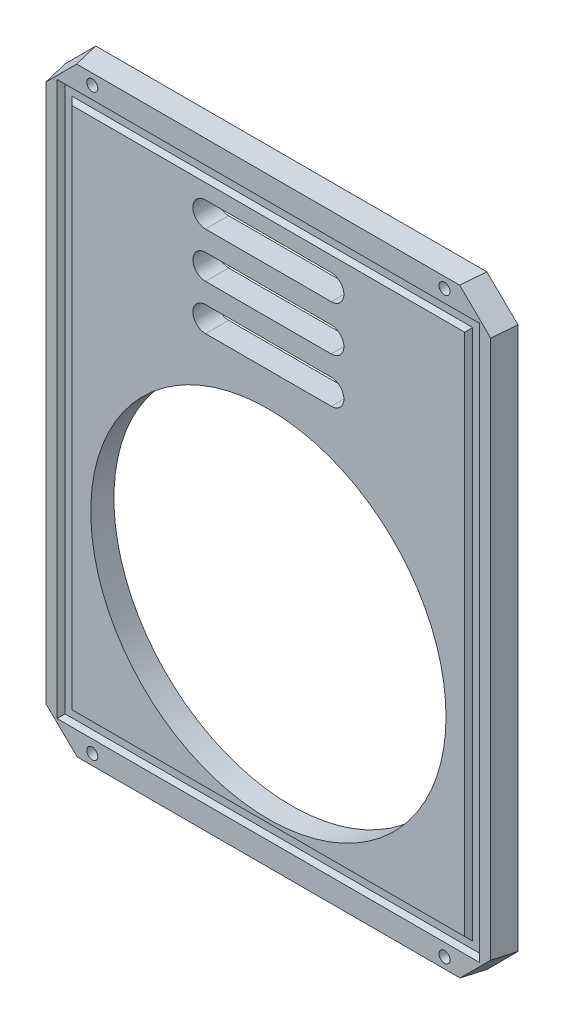
ISO-10303-21;
HEADER;
FILE_DESCRIPTION(('STEP AP214'),'2;1');
FILE_NAME('part.step','',(''),(''),'','','');
FILE_SCHEMA(('AUTOMOTIVE_DESIGN { 1 0 10303 214 1 1 1 1 }'));
ENDSEC;
DATA;
#1=APPLICATION_CONTEXT('core data for automotive mechanical design processes');
#2=APPLICATION_PROTOCOL_DEFINITION('international standard','automotive_design',2000,#1);
#3=PRODUCT_CONTEXT('',#1,'mechanical');
#4=PRODUCT('Part','Part','',(#3));
#5=PRODUCT_RELATED_PRODUCT_CATEGORY('part','',(#4));
#6=PRODUCT_DEFINITION_FORMATION('','',#4);
#7=PRODUCT_DEFINITION_CONTEXT('part definition',#1,'design');
#8=PRODUCT_DEFINITION('design','',#6,#7);
#9=PRODUCT_DEFINITION_SHAPE('','',#8);
#10=(LENGTH_UNIT() NAMED_UNIT(*) SI_UNIT(.MILLI.,.METRE.));
#11=(NAMED_UNIT(*) PLANE_ANGLE_UNIT() SI_UNIT($,.RADIAN.));
#12=(NAMED_UNIT(*) SI_UNIT($,.STERADIAN.) SOLID_ANGLE_UNIT());
#13=UNCERTAINTY_MEASURE_WITH_UNIT(LENGTH_MEASURE(1.E-05),#10,'distance_accuracy_value','');
#14=(GEOMETRIC_REPRESENTATION_CONTEXT(3) GLOBAL_UNCERTAINTY_ASSIGNED_CONTEXT((#13)) GLOBAL_UNIT_ASSIGNED_CONTEXT((#10,
#11,#12)) REPRESENTATION_CONTEXT('',''));
#15=CARTESIAN_POINT('',(0.,0.,0.));
#16=DIRECTION('',(0.,0.,1.));
#17=DIRECTION('',(1.,0.,0.));
#18=AXIS2_PLACEMENT_3D('',#15,#16,#17);
#19=CARTESIAN_POINT('',(0.,0.,5.842));
#20=DIRECTION('',(0.,0.,1.));
#21=DIRECTION('',(1.,0.,0.));
#22=AXIS2_PLACEMENT_3D('',#19,#20,#21);
#23=PLANE('',#22);
#24=CARTESIAN_POINT('',(-15.875,59.055,5.842));
#25=DIRECTION('',(0.,0.,1.));
#26=DIRECTION('',(1.,0.,0.));
#27=AXIS2_PLACEMENT_3D('',#24,#25,#26);
#28=CIRCLE('',#27,3.175);
#29=CARTESIAN_POINT('',(-15.875,62.23,5.842));
#30=VERTEX_POINT('',#29);
#31=CARTESIAN_POINT('',(-15.875,55.88,5.842));
#32=VERTEX_POINT('',#31);
#33=EDGE_CURVE('E81',#30,#32,#28,.T.);
#34=ORIENTED_EDGE('',*,*,#33,.F.);
#35=DIRECTION('',(-1.,0.,0.));
#36=VECTOR('',#35,1.);
#37=CARTESIAN_POINT('',(15.875,62.23,5.842));
#38=LINE('',#37,#36);
#39=CARTESIAN_POINT('',(15.875,62.23,5.842));
#40=VERTEX_POINT('',#39);
#41=EDGE_CURVE('E274',#40,#30,#38,.T.);
#42=ORIENTED_EDGE('',*,*,#41,.F.);
#43=CARTESIAN_POINT('',(15.875,59.055,5.842));
#44=DIRECTION('',(0.,0.,1.));
#45=DIRECTION('',(-1.,0.,0.));
#46=AXIS2_PLACEMENT_3D('',#43,#44,#45);
#47=CIRCLE('',#46,3.175);
#48=CARTESIAN_POINT('',(15.875,55.88,5.842));
#49=VERTEX_POINT('',#48);
#50=EDGE_CURVE('E258',#49,#40,#47,.T.);
#51=ORIENTED_EDGE('',*,*,#50,.F.);
#52=DIRECTION('',(1.,0.,0.));
#53=VECTOR('',#52,1.);
#54=CARTESIAN_POINT('',(15.875,55.88,5.842));
#55=LINE('',#54,#53);
#56=EDGE_CURVE('E268',#32,#49,#55,.T.);
#57=ORIENTED_EDGE('',*,*,#56,.F.);
#58=EDGE_LOOP('',(#34,#42,#51,#57));
#59=FACE_BOUND('',#58,.T.);
#60=CARTESIAN_POINT('',(-15.875,47.625,5.842));
#61=DIRECTION('',(0.,0.,1.));
#62=DIRECTION('',(1.,0.,0.));
#63=AXIS2_PLACEMENT_3D('',#60,#61,#62);
#64=CIRCLE('',#63,3.175);
#65=CARTESIAN_POINT('',(-15.875,50.8,5.842));
#66=VERTEX_POINT('',#65);
#67=CARTESIAN_POINT('',(-15.875,44.45,5.842));
#68=VERTEX_POINT('',#67);
#69=EDGE_CURVE('E89',#66,#68,#64,.T.);
#70=ORIENTED_EDGE('',*,*,#69,.F.);
#71=DIRECTION('',(-1.,0.,0.));
#72=VECTOR('',#71,1.);
#73=CARTESIAN_POINT('',(15.875,50.8,5.842));
#74=LINE('',#73,#72);
#75=CARTESIAN_POINT('',(15.875,50.8,5.842));
#76=VERTEX_POINT('',#75);
#77=EDGE_CURVE('E286',#76,#66,#74,.T.);
#78=ORIENTED_EDGE('',*,*,#77,.F.);
#79=CARTESIAN_POINT('',(15.875,47.625,5.842));
#80=DIRECTION('',(0.,0.,1.));
#81=DIRECTION('',(-1.,0.,0.));
#82=AXIS2_PLACEMENT_3D('',#79,#80,#81);
#83=CIRCLE('',#82,3.175);
#84=CARTESIAN_POINT('',(15.875,44.45,5.842));
#85=VERTEX_POINT('',#84);
#86=EDGE_CURVE('E296',#85,#76,#83,.T.);
#87=ORIENTED_EDGE('',*,*,#86,.F.);
#88=DIRECTION('',(1.,0.,0.));
#89=VECTOR('',#88,1.);
#90=CARTESIAN_POINT('',(15.875,44.45,5.842));
#91=LINE('',#90,#89);
#92=EDGE_CURVE('E299',#68,#85,#91,.T.);
#93=ORIENTED_EDGE('',*,*,#92,.F.);
#94=EDGE_LOOP('',(#70,#78,#87,#93));
#95=FACE_BOUND('',#94,.T.);
#96=CARTESIAN_POINT('',(-15.875,36.195,5.842));
#97=DIRECTION('',(0.,0.,1.));
#98=DIRECTION('',(1.,0.,0.));
#99=AXIS2_PLACEMENT_3D('',#96,#97,#98);
#100=CIRCLE('',#99,3.175);
#101=CARTESIAN_POINT('',(-15.875,39.37,5.842));
#102=VERTEX_POINT('',#101);
#103=CARTESIAN_POINT('',(-15.875,33.02,5.842));
#104=VERTEX_POINT('',#103);
#105=EDGE_CURVE('E293',#102,#104,#100,.T.);
#106=ORIENTED_EDGE('',*,*,#105,.F.);
#107=DIRECTION('',(-1.,0.,0.));
#108=VECTOR('',#107,1.);
#109=CARTESIAN_POINT('',(15.875,39.37,5.842));
#110=LINE('',#109,#108);
#111=CARTESIAN_POINT('',(15.875,39.37,5.842));
#112=VERTEX_POINT('',#111);
#113=EDGE_CURVE('E306',#112,#102,#110,.T.);
#114=ORIENTED_EDGE('',*,*,#113,.F.);
#115=CARTESIAN_POINT('',(15.875,36.195,5.842));
#116=DIRECTION('',(0.,0.,1.));
#117=DIRECTION('',(-1.,0.,0.));
#118=AXIS2_PLACEMENT_3D('',#115,#116,#117);
#119=CIRCLE('',#118,3.175);
#120=CARTESIAN_POINT('',(15.875,33.02,5.842));
#121=VERTEX_POINT('',#120);
#122=EDGE_CURVE('E315',#121,#112,#119,.T.);
#123=ORIENTED_EDGE('',*,*,#122,.F.);
#124=DIRECTION('',(1.,0.,0.));
#125=VECTOR('',#124,1.);
#126=CARTESIAN_POINT('',(15.875,33.02,5.842));
#127=LINE('',#126,#125);
#128=EDGE_CURVE('E318',#104,#121,#127,.T.);
#129=ORIENTED_EDGE('',*,*,#128,.F.);
#130=EDGE_LOOP('',(#106,#114,#123,#129));
#131=FACE_BOUND('',#130,.T.);
#132=DIRECTION('',(1.,0.,0.));
#133=VECTOR('',#132,1.);
#134=CARTESIAN_POINT('',(0.,-66.04,5.842));
#135=LINE('',#134,#133);
#136=CARTESIAN_POINT('',(-49.53,-66.04,5.842));
#137=VERTEX_POINT('',#136);
#138=CARTESIAN_POINT('',(49.53,-66.04,5.842));
#139=VERTEX_POINT('',#138);
#140=EDGE_CURVE('E381',#137,#139,#135,.T.);
#141=ORIENTED_EDGE('',*,*,#140,.T.);
#142=DIRECTION('',(0.,1.,0.));
#143=VECTOR('',#142,1.);
#144=CARTESIAN_POINT('',(49.53,0.,5.842));
#145=LINE('',#144,#143);
#146=CARTESIAN_POINT('',(49.53,66.04,5.842));
#147=VERTEX_POINT('',#146);
#148=EDGE_CURVE('E383',#139,#147,#145,.T.);
#149=ORIENTED_EDGE('',*,*,#148,.T.);
#150=DIRECTION('',(-1.,0.,0.));
#151=VECTOR('',#150,1.);
#152=CARTESIAN_POINT('',(0.,66.04,5.842));
#153=LINE('',#152,#151);
#154=CARTESIAN_POINT('',(-49.53,66.04,5.842));
#155=VERTEX_POINT('',#154);
#156=EDGE_CURVE('E369',#147,#155,#153,.T.);
#157=ORIENTED_EDGE('',*,*,#156,.T.);
#158=DIRECTION('',(0.,-1.,0.));
#159=VECTOR('',#158,1.);
#160=CARTESIAN_POINT('',(-49.53,0.,5.842));
#161=LINE('',#160,#159);
#162=EDGE_CURVE('E379',#155,#137,#161,.T.);
#163=ORIENTED_EDGE('',*,*,#162,.T.);
#164=EDGE_LOOP('',(#141,#149,#157,#163));
#165=FACE_BOUND('',#164,.T.);
#166=CARTESIAN_POINT('',(0.,-20.32,5.842));
#167=DIRECTION('',(0.,0.,1.));
#168=DIRECTION('',(1.,0.,0.));
#169=AXIS2_PLACEMENT_3D('',#166,#167,#168);
#170=CIRCLE('',#169,44.831);
#171=CARTESIAN_POINT('',(44.831,-20.32,5.842));
#172=VERTEX_POINT('',#171);
#173=EDGE_CURVE('E348',#172,#172,#170,.T.);
#174=ORIENTED_EDGE('',*,*,#173,.F.);
#175=EDGE_LOOP('',(#174));
#176=FACE_BOUND('',#175,.T.);
#177=ADVANCED_FACE('F65',(#59,#95,#131,#165,#176),#23,.T.);
#178=DIRECTION('',(0.,-1.,0.));
#179=VECTOR('',#178,1.);
#180=CARTESIAN_POINT('',(53.34,-68.58,5.842));
#181=LINE('',#180,#179);
#182=CARTESIAN_POINT('',(53.34,69.85,5.842));
#183=VERTEX_POINT('',#182);
#184=CARTESIAN_POINT('',(53.34,-69.85,5.842));
#185=VERTEX_POINT('',#184);
#186=EDGE_CURVE('E386',#183,#185,#181,.T.);
#187=ORIENTED_EDGE('',*,*,#186,.T.);
#188=DIRECTION('',(-1.,0.,0.));
#189=VECTOR('',#188,1.);
#190=CARTESIAN_POINT('',(-52.07,-69.85,5.842));
#191=LINE('',#190,#189);
#192=CARTESIAN_POINT('',(-53.34,-69.85,5.842));
#193=VERTEX_POINT('',#192);
#194=EDGE_CURVE('E392',#185,#193,#191,.T.);
#195=ORIENTED_EDGE('',*,*,#194,.T.);
#196=DIRECTION('',(0.,1.,0.));
#197=VECTOR('',#196,1.);
#198=CARTESIAN_POINT('',(-53.34,68.58,5.842));
#199=LINE('',#198,#197);
#200=CARTESIAN_POINT('',(-53.34,69.85,5.842));
#201=VERTEX_POINT('',#200);
#202=EDGE_CURVE('E390',#193,#201,#199,.T.);
#203=ORIENTED_EDGE('',*,*,#202,.T.);
#204=DIRECTION('',(1.,0.,0.));
#205=VECTOR('',#204,1.);
#206=CARTESIAN_POINT('',(52.07,69.85,5.842));
#207=LINE('',#206,#205);
#208=EDGE_CURVE('E388',#201,#183,#207,.T.);
#209=ORIENTED_EDGE('',*,*,#208,.T.);
#210=EDGE_LOOP('',(#187,#195,#203,#209));
#211=FACE_BOUND('',#210,.T.);
#212=CARTESIAN_POINT('',(44.45,-73.025,5.842));
#213=DIRECTION('',(0.,0.,1.));
#214=DIRECTION('',(1.,0.,0.));
#215=AXIS2_PLACEMENT_3D('',#212,#213,#214);
#216=CIRCLE('',#215,1.39700000000001);
#217=CARTESIAN_POINT('',(45.847,-73.025,5.842));
#218=VERTEX_POINT('',#217);
#219=EDGE_CURVE('E330',#218,#218,#216,.T.);
#220=ORIENTED_EDGE('',*,*,#219,.F.);
#221=EDGE_LOOP('',(#220));
#222=FACE_BOUND('',#221,.T.);
#223=CARTESIAN_POINT('',(-44.45,73.025,5.842));
#224=DIRECTION('',(0.,0.,1.));
#225=DIRECTION('',(1.,0.,0.));
#226=AXIS2_PLACEMENT_3D('',#223,#224,#225);
#227=CIRCLE('',#226,1.39700000000001);
#228=CARTESIAN_POINT('',(-43.053,73.025,5.842));
#229=VERTEX_POINT('',#228);
#230=EDGE_CURVE('E342',#229,#229,#227,.T.);
#231=ORIENTED_EDGE('',*,*,#230,.F.);
#232=EDGE_LOOP('',(#231));
#233=FACE_BOUND('',#232,.T.);
#234=DIRECTION('',(0.,-1.,0.));
#235=VECTOR('',#234,1.);
#236=CARTESIAN_POINT('',(56.1198977787012,-76.2,5.842));
#237=LINE('',#236,#235);
#238=CARTESIAN_POINT('',(56.1198977787012,-67.9222265121798,5.842));
#239=VERTEX_POINT('',#238);
#240=CARTESIAN_POINT('',(56.1198977787012,68.0406601341663,5.842));
#241=VERTEX_POINT('',#240);
#242=EDGE_CURVE('E370',#239,#241,#237,.F.);
#243=ORIENTED_EDGE('',*,*,#242,.T.);
#244=DIRECTION('',(0.716538987288938,-0.697547044789772,0.));
#245=VECTOR('',#244,1.);
#246=CARTESIAN_POINT('',(61.3144232927068,62.9838160745163,5.842));
#247=LINE('',#246,#245);
#248=CARTESIAN_POINT('',(48.2634301709131,75.6888912276815,5.842));
#249=VERTEX_POINT('',#248);
#250=EDGE_CURVE('E455',#241,#249,#247,.F.);
#251=ORIENTED_EDGE('',*,*,#250,.T.);
#252=DIRECTION('',(1.,0.,0.));
#253=VECTOR('',#252,1.);
#254=CARTESIAN_POINT('',(57.15,75.6888912276815,5.842));
#255=LINE('',#254,#253);
#256=CARTESIAN_POINT('',(-48.3832331943334,75.6888912276815,5.842));
#257=VERTEX_POINT('',#256);
#258=EDGE_CURVE('E366',#249,#257,#255,.F.);
#259=ORIENTED_EDGE('',*,*,#258,.T.);
#260=DIRECTION('',(0.705737154014619,0.708473760589159,0.));
#261=VECTOR('',#260,1.);
#262=CARTESIAN_POINT('',(-62.1294037094907,61.8894177789994,5.842));
#263=LINE('',#262,#261);
#264=CARTESIAN_POINT('',(-56.1198977787011,67.9222265121798,5.842));
#265=VERTEX_POINT('',#264);
#266=EDGE_CURVE('E453',#257,#265,#263,.F.);
#267=ORIENTED_EDGE('',*,*,#266,.T.);
#268=DIRECTION('',(0.,1.,0.));
#269=VECTOR('',#268,1.);
#270=CARTESIAN_POINT('',(-56.1198977787011,-76.2,5.842));
#271=LINE('',#270,#269);
#272=CARTESIAN_POINT('',(-56.1198977787011,-68.0406601341664,5.842));
#273=VERTEX_POINT('',#272);
#274=EDGE_CURVE('E365',#265,#273,#271,.F.);
#275=ORIENTED_EDGE('',*,*,#274,.T.);
#276=DIRECTION('',(-0.716538987288939,0.697547044789769,0.));
#277=VECTOR('',#276,1.);
#278=CARTESIAN_POINT('',(-61.3144232927067,-62.9838160745165,5.842));
#279=LINE('',#278,#277);
#280=CARTESIAN_POINT('',(-48.2634301709131,-75.6888912276816,5.842));
#281=VERTEX_POINT('',#280);
#282=EDGE_CURVE('E449',#273,#281,#279,.F.);
#283=ORIENTED_EDGE('',*,*,#282,.T.);
#284=DIRECTION('',(-1.,0.,0.));
#285=VECTOR('',#284,1.);
#286=CARTESIAN_POINT('',(57.15,-75.6888912276816,5.842));
#287=LINE('',#286,#285);
#288=CARTESIAN_POINT('',(48.3832331943335,-75.6888912276816,5.842));
#289=VERTEX_POINT('',#288);
#290=EDGE_CURVE('E371',#281,#289,#287,.F.);
#291=ORIENTED_EDGE('',*,*,#290,.T.);
#292=DIRECTION('',(-0.705737154014618,-0.70847376058916,0.));
#293=VECTOR('',#292,1.);
#294=CARTESIAN_POINT('',(62.1294037094907,-61.8894177789993,5.842));
#295=LINE('',#294,#293);
#296=EDGE_CURVE('E451',#289,#239,#295,.F.);
#297=ORIENTED_EDGE('',*,*,#296,.T.);
#298=EDGE_LOOP('',(#243,#251,#259,#267,#275,#283,#291,#297));
#299=FACE_BOUND('',#298,.T.);
#300=CARTESIAN_POINT('',(44.45,73.025,5.842));
#301=DIRECTION('',(0.,0.,1.));
#302=DIRECTION('',(1.,0.,0.));
#303=AXIS2_PLACEMENT_3D('',#300,#301,#302);
#304=CIRCLE('',#303,1.39700000000001);
#305=CARTESIAN_POINT('',(45.847,73.025,5.842));
#306=VERTEX_POINT('',#305);
#307=EDGE_CURVE('E336',#306,#306,#304,.T.);
#308=ORIENTED_EDGE('',*,*,#307,.F.);
#309=EDGE_LOOP('',(#308));
#310=FACE_BOUND('',#309,.T.);
#311=CARTESIAN_POINT('',(-44.45,-73.025,5.842));
#312=DIRECTION('',(0.,0.,1.));
#313=DIRECTION('',(1.,0.,0.));
#314=AXIS2_PLACEMENT_3D('',#311,#312,#313);
#315=CIRCLE('',#314,1.39700000000001);
#316=CARTESIAN_POINT('',(-43.053,-73.025,5.842));
#317=VERTEX_POINT('',#316);
#318=EDGE_CURVE('E322',#317,#317,#315,.T.);
#319=ORIENTED_EDGE('',*,*,#318,.F.);
#320=EDGE_LOOP('',(#319));
#321=FACE_BOUND('',#320,.T.);
#322=ADVANCED_FACE('F515',(#211,#222,#233,#299,#310,#321),#23,.T.);
#323=CARTESIAN_POINT('',(0.,0.,0.));
#324=DIRECTION('',(0.,0.,1.));
#325=DIRECTION('',(1.,0.,0.));
#326=AXIS2_PLACEMENT_3D('',#323,#324,#325);
#327=PLANE('',#326);
#328=DIRECTION('',(-1.,0.,0.));
#329=VECTOR('',#328,1.);
#330=CARTESIAN_POINT('',(0.,62.23,0.));
#331=LINE('',#330,#329);
#332=CARTESIAN_POINT('',(15.875,62.23,0.));
#333=VERTEX_POINT('',#332);
#334=CARTESIAN_POINT('',(-15.875,62.23,0.));
#335=VERTEX_POINT('',#334);
#336=EDGE_CURVE('E74',#333,#335,#331,.T.);
#337=ORIENTED_EDGE('',*,*,#336,.T.);
#338=CARTESIAN_POINT('',(-15.875,59.055,0.));
#339=DIRECTION('',(0.,0.,1.));
#340=DIRECTION('',(1.,0.,0.));
#341=AXIS2_PLACEMENT_3D('',#338,#339,#340);
#342=CIRCLE('',#341,3.175);
#343=CARTESIAN_POINT('',(-15.875,55.88,0.));
#344=VERTEX_POINT('',#343);
#345=EDGE_CURVE('E12',#335,#344,#342,.T.);
#346=ORIENTED_EDGE('',*,*,#345,.T.);
#347=DIRECTION('',(1.,0.,0.));
#348=VECTOR('',#347,1.);
#349=CARTESIAN_POINT('',(0.,55.88,0.));
#350=LINE('',#349,#348);
#351=CARTESIAN_POINT('',(15.875,55.88,0.));
#352=VERTEX_POINT('',#351);
#353=EDGE_CURVE('E491',#344,#352,#350,.T.);
#354=ORIENTED_EDGE('',*,*,#353,.T.);
#355=CARTESIAN_POINT('',(15.875,59.055,0.));
#356=DIRECTION('',(0.,0.,1.));
#357=DIRECTION('',(1.,0.,0.));
#358=AXIS2_PLACEMENT_3D('',#355,#356,#357);
#359=CIRCLE('',#358,3.175);
#360=EDGE_CURVE('E261',#352,#333,#359,.T.);
#361=ORIENTED_EDGE('',*,*,#360,.T.);
#362=EDGE_LOOP('',(#337,#346,#354,#361));
#363=FACE_BOUND('',#362,.T.);
#364=DIRECTION('',(-1.,0.,0.));
#365=VECTOR('',#364,1.);
#366=CARTESIAN_POINT('',(0.,50.8,0.));
#367=LINE('',#366,#365);
#368=CARTESIAN_POINT('',(15.875,50.8,0.));
#369=VERTEX_POINT('',#368);
#370=CARTESIAN_POINT('',(-15.875,50.8,0.));
#371=VERTEX_POINT('',#370);
#372=EDGE_CURVE('E485',#369,#371,#367,.T.);
#373=ORIENTED_EDGE('',*,*,#372,.T.);
#374=CARTESIAN_POINT('',(-15.875,47.625,0.));
#375=DIRECTION('',(0.,0.,1.));
#376=DIRECTION('',(1.,0.,0.));
#377=AXIS2_PLACEMENT_3D('',#374,#375,#376);
#378=CIRCLE('',#377,3.175);
#379=CARTESIAN_POINT('',(-15.875,44.45,0.));
#380=VERTEX_POINT('',#379);
#381=EDGE_CURVE('E488',#371,#380,#378,.T.);
#382=ORIENTED_EDGE('',*,*,#381,.T.);
#383=DIRECTION('',(1.,0.,0.));
#384=VECTOR('',#383,1.);
#385=CARTESIAN_POINT('',(0.,44.45,0.));
#386=LINE('',#385,#384);
#387=CARTESIAN_POINT('',(15.875,44.45,0.));
#388=VERTEX_POINT('',#387);
#389=EDGE_CURVE('E479',#380,#388,#386,.T.);
#390=ORIENTED_EDGE('',*,*,#389,.T.);
#391=CARTESIAN_POINT('',(15.875,47.625,0.));
#392=DIRECTION('',(0.,0.,1.));
#393=DIRECTION('',(1.,0.,0.));
#394=AXIS2_PLACEMENT_3D('',#391,#392,#393);
#395=CIRCLE('',#394,3.175);
#396=EDGE_CURVE('E482',#388,#369,#395,.T.);
#397=ORIENTED_EDGE('',*,*,#396,.T.);
#398=EDGE_LOOP('',(#373,#382,#390,#397));
#399=FACE_BOUND('',#398,.T.);
#400=DIRECTION('',(-1.,0.,0.));
#401=VECTOR('',#400,1.);
#402=CARTESIAN_POINT('',(0.,39.37,0.));
#403=LINE('',#402,#401);
#404=CARTESIAN_POINT('',(15.875,39.37,0.));
#405=VERTEX_POINT('',#404);
#406=CARTESIAN_POINT('',(-15.875,39.37,0.));
#407=VERTEX_POINT('',#406);
#408=EDGE_CURVE('E473',#405,#407,#403,.T.);
#409=ORIENTED_EDGE('',*,*,#408,.T.);
#410=CARTESIAN_POINT('',(-15.875,36.195,0.));
#411=DIRECTION('',(0.,0.,1.));
#412=DIRECTION('',(1.,0.,0.));
#413=AXIS2_PLACEMENT_3D('',#410,#411,#412);
#414=CIRCLE('',#413,3.175);
#415=CARTESIAN_POINT('',(-15.875,33.02,0.));
#416=VERTEX_POINT('',#415);
#417=EDGE_CURVE('E476',#407,#416,#414,.T.);
#418=ORIENTED_EDGE('',*,*,#417,.T.);
#419=DIRECTION('',(1.,0.,0.));
#420=VECTOR('',#419,1.);
#421=CARTESIAN_POINT('',(0.,33.02,0.));
#422=LINE('',#421,#420);
#423=CARTESIAN_POINT('',(15.875,33.02,0.));
#424=VERTEX_POINT('',#423);
#425=EDGE_CURVE('E467',#416,#424,#422,.T.);
#426=ORIENTED_EDGE('',*,*,#425,.T.);
#427=CARTESIAN_POINT('',(15.875,36.195,0.));
#428=DIRECTION('',(0.,0.,1.));
#429=DIRECTION('',(1.,0.,0.));
#430=AXIS2_PLACEMENT_3D('',#427,#428,#429);
#431=CIRCLE('',#430,3.175);
#432=EDGE_CURVE('E470',#424,#405,#431,.T.);
#433=ORIENTED_EDGE('',*,*,#432,.T.);
#434=EDGE_LOOP('',(#409,#418,#426,#433));
#435=FACE_BOUND('',#434,.T.);
#436=DIRECTION('',(-1.,0.,0.));
#437=VECTOR('',#436,1.);
#438=CARTESIAN_POINT('',(57.15,76.2,0.));
#439=LINE('',#438,#437);
#440=CARTESIAN_POINT('',(49.2935323922119,76.2,0.));
#441=VERTEX_POINT('',#440);
#442=CARTESIAN_POINT('',(-49.4133354156323,76.2,0.));
#443=VERTEX_POINT('',#442);
#444=EDGE_CURVE('E362',#441,#443,#439,.T.);
#445=ORIENTED_EDGE('',*,*,#444,.F.);
#446=DIRECTION('',(-0.716538987288938,0.697547044789772,0.));
#447=VECTOR('',#446,1.);
#448=CARTESIAN_POINT('',(49.355950075461,76.1392367041216,0.));
#449=LINE('',#448,#447);
#450=CARTESIAN_POINT('',(57.15,68.5517689064847,0.));
#451=VERTEX_POINT('',#450);
#452=EDGE_CURVE('E442',#441,#451,#449,.F.);
#453=ORIENTED_EDGE('',*,*,#452,.T.);
#454=DIRECTION('',(0.,1.,0.));
#455=VECTOR('',#454,1.);
#456=CARTESIAN_POINT('',(57.15,-76.2,0.));
#457=LINE('',#456,#455);
#458=CARTESIAN_POINT('',(57.15,-68.4333352844983,0.));
#459=VERTEX_POINT('',#458);
#460=EDGE_CURVE('E359',#459,#451,#457,.T.);
#461=ORIENTED_EDGE('',*,*,#460,.F.);
#462=DIRECTION('',(0.705737154014618,0.70847376058916,0.));
#463=VECTOR('',#462,1.);
#464=CARTESIAN_POINT('',(57.1788337977683,-68.4043896791539,0.));
#465=LINE('',#464,#463);
#466=CARTESIAN_POINT('',(49.4133354156323,-76.2,0.));
#467=VERTEX_POINT('',#466);
#468=EDGE_CURVE('E438',#459,#467,#465,.F.);
#469=ORIENTED_EDGE('',*,*,#468,.T.);
#470=DIRECTION('',(1.,0.,0.));
#471=VECTOR('',#470,1.);
#472=CARTESIAN_POINT('',(57.15,-76.2,0.));
#473=LINE('',#472,#471);
#474=CARTESIAN_POINT('',(-49.2935323922119,-76.2,0.));
#475=VERTEX_POINT('',#474);
#476=EDGE_CURVE('E356',#475,#467,#473,.T.);
#477=ORIENTED_EDGE('',*,*,#476,.F.);
#478=DIRECTION('',(0.716538987288939,-0.697547044789769,0.));
#479=VECTOR('',#478,1.);
#480=CARTESIAN_POINT('',(-48.447864972647,-77.0232529141567,0.));
#481=LINE('',#480,#479);
#482=CARTESIAN_POINT('',(-57.15,-68.5517689064849,0.));
#483=VERTEX_POINT('',#482);
#484=EDGE_CURVE('E436',#475,#483,#481,.F.);
#485=ORIENTED_EDGE('',*,*,#484,.T.);
#486=DIRECTION('',(0.,-1.,0.));
#487=VECTOR('',#486,1.);
#488=CARTESIAN_POINT('',(-57.15,-76.2,0.));
#489=LINE('',#488,#487);
#490=CARTESIAN_POINT('',(-57.15,68.4333352844982,0.));
#491=VERTEX_POINT('',#490);
#492=EDGE_CURVE('E351',#491,#483,#489,.T.);
#493=ORIENTED_EDGE('',*,*,#492,.F.);
#494=DIRECTION('',(-0.705737154014619,-0.708473760589159,0.));
#495=VECTOR('',#494,1.);
#496=CARTESIAN_POINT('',(-56.6130477183053,68.9723696829356,0.));
#497=LINE('',#496,#495);
#498=EDGE_CURVE('E440',#491,#443,#497,.F.);
#499=ORIENTED_EDGE('',*,*,#498,.T.);
#500=EDGE_LOOP('',(#445,#453,#461,#469,#477,#485,#493,#499));
#501=FACE_BOUND('',#500,.T.);
#502=CARTESIAN_POINT('',(0.,-20.32,0.));
#503=DIRECTION('',(0.,0.,1.));
#504=DIRECTION('',(1.,0.,0.));
#505=AXIS2_PLACEMENT_3D('',#502,#503,#504);
#506=CIRCLE('',#505,44.831);
#507=CARTESIAN_POINT('',(44.831,-20.32,0.));
#508=VERTEX_POINT('',#507);
#509=EDGE_CURVE('E345',#508,#508,#506,.T.);
#510=ORIENTED_EDGE('',*,*,#509,.T.);
#511=EDGE_LOOP('',(#510));
#512=FACE_BOUND('',#511,.T.);
#513=CARTESIAN_POINT('',(-44.45,73.025,0.));
#514=DIRECTION('',(0.,0.,1.));
#515=DIRECTION('',(1.,0.,0.));
#516=AXIS2_PLACEMENT_3D('',#513,#514,#515);
#517=CIRCLE('',#516,1.39700000000001);
#518=CARTESIAN_POINT('',(-43.053,73.025,0.));
#519=VERTEX_POINT('',#518);
#520=EDGE_CURVE('E339',#519,#519,#517,.T.);
#521=ORIENTED_EDGE('',*,*,#520,.T.);
#522=EDGE_LOOP('',(#521));
#523=FACE_BOUND('',#522,.T.);
#524=CARTESIAN_POINT('',(44.45,73.025,0.));
#525=DIRECTION('',(0.,0.,1.));
#526=DIRECTION('',(1.,0.,0.));
#527=AXIS2_PLACEMENT_3D('',#524,#525,#526);
#528=CIRCLE('',#527,1.39700000000001);
#529=CARTESIAN_POINT('',(45.847,73.025,0.));
#530=VERTEX_POINT('',#529);
#531=EDGE_CURVE('E333',#530,#530,#528,.T.);
#532=ORIENTED_EDGE('',*,*,#531,.T.);
#533=EDGE_LOOP('',(#532));
#534=FACE_BOUND('',#533,.T.);
#535=CARTESIAN_POINT('',(44.45,-73.025,0.));
#536=DIRECTION('',(0.,0.,1.));
#537=DIRECTION('',(1.,0.,0.));
#538=AXIS2_PLACEMENT_3D('',#535,#536,#537);
#539=CIRCLE('',#538,1.39700000000001);
#540=CARTESIAN_POINT('',(45.847,-73.025,0.));
#541=VERTEX_POINT('',#540);
#542=EDGE_CURVE('E325',#541,#541,#539,.T.);
#543=ORIENTED_EDGE('',*,*,#542,.T.);
#544=EDGE_LOOP('',(#543));
#545=FACE_BOUND('',#544,.T.);
#546=CARTESIAN_POINT('',(-44.45,-73.025,0.));
#547=DIRECTION('',(0.,0.,1.));
#548=DIRECTION('',(1.,0.,0.));
#549=AXIS2_PLACEMENT_3D('',#546,#547,#548);
#550=CIRCLE('',#549,1.39700000000001);
#551=CARTESIAN_POINT('',(-43.053,-73.025,0.));
#552=VERTEX_POINT('',#551);
#553=EDGE_CURVE('E326',#552,#552,#550,.T.);
#554=ORIENTED_EDGE('',*,*,#553,.T.);
#555=EDGE_LOOP('',(#554));
#556=FACE_BOUND('',#555,.T.);
#557=ADVANCED_FACE('F495',(#363,#399,#435,#501,#512,#523,#534,#545,#556),#327,.F.);
#558=CARTESIAN_POINT('',(-57.15,-76.2,0.));
#559=DIRECTION('',(-0.984807753012208,0.,0.173648177666931));
#560=DIRECTION('',(0.173648177666931,0.,0.984807753012208));
#561=AXIS2_PLACEMENT_3D('',#558,#559,#560);
#562=PLANE('',#561);
#563=ORIENTED_EDGE('',*,*,#274,.F.);
#564=DIRECTION('',(0.173007208809883,-0.0858414827856261,0.981172637986292));
#565=VECTOR('',#564,1.);
#566=CARTESIAN_POINT('',(-55.0020220854708,67.3675669246574,12.1817880956096));
#567=LINE('',#566,#565);
#568=EDGE_CURVE('E459',#265,#491,#567,.F.);
#569=ORIENTED_EDGE('',*,*,#568,.T.);
#570=ORIENTED_EDGE('',*,*,#492,.T.);
#571=DIRECTION('',(-0.173007208809883,-0.0858414827856261,-0.981172637986292));
#572=VECTOR('',#571,1.);
#573=CARTESIAN_POINT('',(-57.2635853739511,-68.6081268871135,-0.644174666263398));
#574=LINE('',#573,#572);
#575=EDGE_CURVE('E457',#483,#273,#574,.F.);
#576=ORIENTED_EDGE('',*,*,#575,.T.);
#577=EDGE_LOOP('',(#563,#569,#570,#576));
#578=FACE_BOUND('',#577,.T.);
#579=ADVANCED_FACE('F528',(#578),#562,.T.);
#580=CARTESIAN_POINT('',(57.15,-76.2,0.));
#581=DIRECTION('',(0.,-0.996194698091746,0.0871557427476584));
#582=DIRECTION('',(0.,-0.0871557427476584,-0.996194698091746));
#583=AXIS2_PLACEMENT_3D('',#580,#581,#582);
#584=PLANE('',#583);
#585=ORIENTED_EDGE('',*,*,#476,.T.);
#586=DIRECTION('',(0.173007208809883,-0.0858414827856261,-0.981172637986292));
#587=VECTOR('',#586,1.);
#588=CARTESIAN_POINT('',(49.6449053475418,-76.3148987169981,-1.3132983448082));
#589=LINE('',#588,#587);
#590=EDGE_CURVE('E465',#467,#289,#589,.F.);
#591=ORIENTED_EDGE('',*,*,#590,.T.);
#592=ORIENTED_EDGE('',*,*,#290,.F.);
#593=DIRECTION('',(0.173007208809883,0.0858414827856261,0.981172637986292));
#594=VECTOR('',#593,1.);
#595=CARTESIAN_POINT('',(-46.1075184091227,-74.6191863080997,18.0687831793416));
#596=LINE('',#595,#594);
#597=EDGE_CURVE('E462',#281,#475,#596,.F.);
#598=ORIENTED_EDGE('',*,*,#597,.T.);
#599=EDGE_LOOP('',(#585,#591,#592,#598));
#600=FACE_BOUND('',#599,.T.);
#601=ADVANCED_FACE('F534',(#600),#584,.T.);
#602=CARTESIAN_POINT('',(57.15,-76.2,0.));
#603=DIRECTION('',(0.984807753012208,0.,0.173648177666931));
#604=DIRECTION('',(0.173648177666931,0.,-0.984807753012208));
#605=AXIS2_PLACEMENT_3D('',#602,#603,#604);
#606=PLANE('',#605);
#607=ORIENTED_EDGE('',*,*,#460,.T.);
#608=DIRECTION('',(0.173007208809883,0.0858414827856261,-0.981172637986292));
#609=VECTOR('',#608,1.);
#610=CARTESIAN_POINT('',(55.0002632046163,67.4851278376878,12.191763204623));
#611=LINE('',#610,#609);
#612=EDGE_CURVE('E447',#451,#241,#611,.F.);
#613=ORIENTED_EDGE('',*,*,#612,.T.);
#614=ORIENTED_EDGE('',*,*,#242,.F.);
#615=DIRECTION('',(-0.173007208809883,0.0858414827856261,0.981172637986292));
#616=VECTOR('',#615,1.);
#617=CARTESIAN_POINT('',(57.2653442548057,-68.490565974083,-0.654149775276808));
#618=LINE('',#617,#616);
#619=EDGE_CURVE('E444',#239,#459,#618,.F.);
#620=ORIENTED_EDGE('',*,*,#619,.T.);
#621=EDGE_LOOP('',(#607,#613,#614,#620));
#622=FACE_BOUND('',#621,.T.);
#623=ADVANCED_FACE('F532',(#622),#606,.T.);
#624=CARTESIAN_POINT('',(57.15,76.2,0.));
#625=DIRECTION('',(0.,0.996194698091746,0.0871557427476584));
#626=DIRECTION('',(0.,-0.0871557427476584,0.996194698091746));
#627=AXIS2_PLACEMENT_3D('',#624,#625,#626);
#628=PLANE('',#627);
#629=ORIENTED_EDGE('',*,*,#258,.F.);
#630=DIRECTION('',(-0.173007208809883,-0.0858414827856261,0.981172637986292));
#631=VECTOR('',#630,1.);
#632=CARTESIAN_POINT('',(49.528688207634,76.3166779351008,-1.33363490078078));
#633=LINE('',#632,#631);
#634=EDGE_CURVE('E433',#249,#441,#633,.F.);
#635=ORIENTED_EDGE('',*,*,#634,.T.);
#636=ORIENTED_EDGE('',*,*,#444,.T.);
#637=DIRECTION('',(-0.173007208809883,0.0858414827856261,-0.981172637986292));
#638=VECTOR('',#637,1.);
#639=CARTESIAN_POINT('',(-46.2237355490304,74.6174070899969,18.0891197353141));
#640=LINE('',#639,#638);
#641=EDGE_CURVE('E413',#443,#257,#640,.F.);
#642=ORIENTED_EDGE('',*,*,#641,.T.);
#643=EDGE_LOOP('',(#629,#635,#636,#642));
#644=FACE_BOUND('',#643,.T.);
#645=ADVANCED_FACE('F529',(#644),#628,.T.);
#646=CARTESIAN_POINT('',(0.,-20.32,5.842));
#647=DIRECTION('',(0.,0.,-1.));
#648=DIRECTION('',(-1.,0.,0.));
#649=AXIS2_PLACEMENT_3D('',#646,#647,#648);
#650=CYLINDRICAL_SURFACE('',#649,44.831);
#651=ORIENTED_EDGE('',*,*,#173,.T.);
#652=EDGE_LOOP('',(#651));
#653=FACE_BOUND('',#652,.T.);
#654=ORIENTED_EDGE('',*,*,#509,.F.);
#655=EDGE_LOOP('',(#654));
#656=FACE_BOUND('',#655,.T.);
#657=ADVANCED_FACE('F525',(#653,#656),#650,.F.);
#658=CARTESIAN_POINT('',(-44.45,73.025,5.842));
#659=DIRECTION('',(0.,0.,-1.));
#660=DIRECTION('',(-1.,0.,0.));
#661=AXIS2_PLACEMENT_3D('',#658,#659,#660);
#662=CYLINDRICAL_SURFACE('',#661,1.39700000000001);
#663=ORIENTED_EDGE('',*,*,#230,.T.);
#664=EDGE_LOOP('',(#663));
#665=FACE_BOUND('',#664,.T.);
#666=ORIENTED_EDGE('',*,*,#520,.F.);
#667=EDGE_LOOP('',(#666));
#668=FACE_BOUND('',#667,.T.);
#669=ADVANCED_FACE('F675',(#665,#668),#662,.F.);
#670=CARTESIAN_POINT('',(44.45,73.025,5.842));
#671=DIRECTION('',(0.,0.,-1.));
#672=DIRECTION('',(-1.,0.,0.));
#673=AXIS2_PLACEMENT_3D('',#670,#671,#672);
#674=CYLINDRICAL_SURFACE('',#673,1.39700000000001);
#675=ORIENTED_EDGE('',*,*,#307,.T.);
#676=EDGE_LOOP('',(#675));
#677=FACE_BOUND('',#676,.T.);
#678=ORIENTED_EDGE('',*,*,#531,.F.);
#679=EDGE_LOOP('',(#678));
#680=FACE_BOUND('',#679,.T.);
#681=ADVANCED_FACE('F669',(#677,#680),#674,.F.);
#682=CARTESIAN_POINT('',(44.45,-73.025,5.842));
#683=DIRECTION('',(0.,0.,-1.));
#684=DIRECTION('',(-1.,0.,0.));
#685=AXIS2_PLACEMENT_3D('',#682,#683,#684);
#686=CYLINDRICAL_SURFACE('',#685,1.39700000000001);
#687=ORIENTED_EDGE('',*,*,#219,.T.);
#688=EDGE_LOOP('',(#687));
#689=FACE_BOUND('',#688,.T.);
#690=ORIENTED_EDGE('',*,*,#542,.F.);
#691=EDGE_LOOP('',(#690));
#692=FACE_BOUND('',#691,.T.);
#693=ADVANCED_FACE('F660',(#689,#692),#686,.F.);
#694=CARTESIAN_POINT('',(-44.45,-73.025,5.842));
#695=DIRECTION('',(0.,0.,-1.));
#696=DIRECTION('',(-1.,0.,0.));
#697=AXIS2_PLACEMENT_3D('',#694,#695,#696);
#698=CYLINDRICAL_SURFACE('',#697,1.39700000000001);
#699=ORIENTED_EDGE('',*,*,#318,.T.);
#700=EDGE_LOOP('',(#699));
#701=FACE_BOUND('',#700,.T.);
#702=ORIENTED_EDGE('',*,*,#553,.F.);
#703=EDGE_LOOP('',(#702));
#704=FACE_BOUND('',#703,.T.);
#705=ADVANCED_FACE('F658',(#701,#704),#698,.F.);
#706=CARTESIAN_POINT('',(0.,0.,4.826));
#707=DIRECTION('',(0.,0.,1.));
#708=DIRECTION('',(1.,0.,0.));
#709=AXIS2_PLACEMENT_3D('',#706,#707,#708);
#710=PLANE('',#709);
#711=DIRECTION('',(1.,0.,0.));
#712=VECTOR('',#711,1.);
#713=CARTESIAN_POINT('',(50.8,-68.834,4.826));
#714=LINE('',#713,#712);
#715=CARTESIAN_POINT('',(-52.324,-68.834,4.826));
#716=VERTEX_POINT('',#715);
#717=CARTESIAN_POINT('',(52.324,-68.834,4.826));
#718=VERTEX_POINT('',#717);
#719=EDGE_CURVE('E404',#716,#718,#714,.T.);
#720=ORIENTED_EDGE('',*,*,#719,.T.);
#721=DIRECTION('',(0.,1.,0.));
#722=VECTOR('',#721,1.);
#723=CARTESIAN_POINT('',(52.324,-67.31,4.826));
#724=LINE('',#723,#722);
#725=CARTESIAN_POINT('',(52.324,68.834,4.826));
#726=VERTEX_POINT('',#725);
#727=EDGE_CURVE('E411',#718,#726,#724,.T.);
#728=ORIENTED_EDGE('',*,*,#727,.T.);
#729=DIRECTION('',(-1.,0.,0.));
#730=VECTOR('',#729,1.);
#731=CARTESIAN_POINT('',(50.8,68.834,4.826));
#732=LINE('',#731,#730);
#733=CARTESIAN_POINT('',(-52.324,68.834,4.826));
#734=VERTEX_POINT('',#733);
#735=EDGE_CURVE('E409',#726,#734,#732,.T.);
#736=ORIENTED_EDGE('',*,*,#735,.T.);
#737=DIRECTION('',(0.,-1.,0.));
#738=VECTOR('',#737,1.);
#739=CARTESIAN_POINT('',(-52.324,-67.31,4.826));
#740=LINE('',#739,#738);
#741=EDGE_CURVE('E407',#734,#716,#740,.T.);
#742=ORIENTED_EDGE('',*,*,#741,.T.);
#743=EDGE_LOOP('',(#720,#728,#736,#742));
#744=FACE_BOUND('',#743,.T.);
#745=DIRECTION('',(0.,-1.,0.));
#746=VECTOR('',#745,1.);
#747=CARTESIAN_POINT('',(-50.546,0.,4.826));
#748=LINE('',#747,#746);
#749=CARTESIAN_POINT('',(-50.546,-67.056,4.826));
#750=VERTEX_POINT('',#749);
#751=CARTESIAN_POINT('',(-50.546,67.056,4.826));
#752=VERTEX_POINT('',#751);
#753=EDGE_CURVE('E400',#750,#752,#748,.F.);
#754=ORIENTED_EDGE('',*,*,#753,.T.);
#755=DIRECTION('',(-1.,0.,0.));
#756=VECTOR('',#755,1.);
#757=CARTESIAN_POINT('',(0.,67.056,4.826));
#758=LINE('',#757,#756);
#759=CARTESIAN_POINT('',(50.546,67.056,4.826));
#760=VERTEX_POINT('',#759);
#761=EDGE_CURVE('E402',#752,#760,#758,.F.);
#762=ORIENTED_EDGE('',*,*,#761,.T.);
#763=DIRECTION('',(0.,1.,0.));
#764=VECTOR('',#763,1.);
#765=CARTESIAN_POINT('',(50.546,0.,4.826));
#766=LINE('',#765,#764);
#767=CARTESIAN_POINT('',(50.546,-67.056,4.826));
#768=VERTEX_POINT('',#767);
#769=EDGE_CURVE('E395',#760,#768,#766,.F.);
#770=ORIENTED_EDGE('',*,*,#769,.T.);
#771=DIRECTION('',(1.,0.,0.));
#772=VECTOR('',#771,1.);
#773=CARTESIAN_POINT('',(0.,-67.056,4.826));
#774=LINE('',#773,#772);
#775=EDGE_CURVE('E398',#768,#750,#774,.F.);
#776=ORIENTED_EDGE('',*,*,#775,.T.);
#777=EDGE_LOOP('',(#754,#762,#770,#776));
#778=FACE_BOUND('',#777,.T.);
#779=ADVANCED_FACE('F573',(#744,#778),#710,.T.);
#780=CARTESIAN_POINT('',(-49.53,0.,5.842));
#781=DIRECTION('',(0.707106781186544,0.,-0.707106781186551));
#782=DIRECTION('',(0.,-1.,0.));
#783=AXIS2_PLACEMENT_3D('',#780,#781,#782);
#784=PLANE('',#783);
#785=DIRECTION('',(0.577350269189629,-0.577350269189626,0.577350269189623));
#786=VECTOR('',#785,1.);
#787=CARTESIAN_POINT('',(-33.0199999999998,49.5299999999999,22.352));
#788=LINE('',#787,#786);
#789=EDGE_CURVE('E419',#752,#155,#788,.T.);
#790=ORIENTED_EDGE('',*,*,#789,.F.);
#791=ORIENTED_EDGE('',*,*,#753,.F.);
#792=DIRECTION('',(0.577350269189629,0.577350269189626,0.577350269189623));
#793=VECTOR('',#792,1.);
#794=CARTESIAN_POINT('',(-27.5166666666665,-44.0266666666667,27.8553333333332));
#795=LINE('',#794,#793);
#796=EDGE_CURVE('E329',#137,#750,#795,.F.);
#797=ORIENTED_EDGE('',*,*,#796,.F.);
#798=ORIENTED_EDGE('',*,*,#162,.F.);
#799=EDGE_LOOP('',(#790,#791,#797,#798));
#800=FACE_BOUND('',#799,.T.);
#801=ADVANCED_FACE('F567',(#800),#784,.F.);
#802=CARTESIAN_POINT('',(0.,-66.04,5.842));
#803=DIRECTION('',(0.,0.707106781186546,-0.707106781186549));
#804=DIRECTION('',(1.,0.,0.));
#805=AXIS2_PLACEMENT_3D('',#802,#803,#804);
#806=PLANE('',#805);
#807=ORIENTED_EDGE('',*,*,#796,.T.);
#808=ORIENTED_EDGE('',*,*,#775,.F.);
#809=DIRECTION('',(-0.577350269189629,0.577350269189625,0.577350269189623));
#810=VECTOR('',#809,1.);
#811=CARTESIAN_POINT('',(33.0199999999998,-49.5299999999999,22.352));
#812=LINE('',#811,#810);
#813=EDGE_CURVE('E416',#139,#768,#812,.F.);
#814=ORIENTED_EDGE('',*,*,#813,.F.);
#815=ORIENTED_EDGE('',*,*,#140,.F.);
#816=EDGE_LOOP('',(#807,#808,#814,#815));
#817=FACE_BOUND('',#816,.T.);
#818=ADVANCED_FACE('F560',(#817),#806,.F.);
#819=CARTESIAN_POINT('',(0.,66.04,5.842));
#820=DIRECTION('',(0.,-0.707106781186546,-0.707106781186549));
#821=DIRECTION('',(-1.,0.,0.));
#822=AXIS2_PLACEMENT_3D('',#819,#820,#821);
#823=PLANE('',#822);
#824=ORIENTED_EDGE('',*,*,#789,.T.);
#825=ORIENTED_EDGE('',*,*,#156,.F.);
#826=DIRECTION('',(0.577350269189629,0.577350269189625,-0.577350269189623));
#827=VECTOR('',#826,1.);
#828=CARTESIAN_POINT('',(33.0199999999998,49.5299999999999,22.352));
#829=LINE('',#828,#827);
#830=EDGE_CURVE('E414',#760,#147,#829,.F.);
#831=ORIENTED_EDGE('',*,*,#830,.F.);
#832=ORIENTED_EDGE('',*,*,#761,.F.);
#833=EDGE_LOOP('',(#824,#825,#831,#832));
#834=FACE_BOUND('',#833,.T.);
#835=ADVANCED_FACE('F553',(#834),#823,.F.);
#836=CARTESIAN_POINT('',(49.53,0.,5.842));
#837=DIRECTION('',(-0.707106781186544,0.,-0.707106781186551));
#838=DIRECTION('',(0.,1.,0.));
#839=AXIS2_PLACEMENT_3D('',#836,#837,#838);
#840=PLANE('',#839);
#841=ORIENTED_EDGE('',*,*,#813,.T.);
#842=ORIENTED_EDGE('',*,*,#769,.F.);
#843=ORIENTED_EDGE('',*,*,#830,.T.);
#844=ORIENTED_EDGE('',*,*,#148,.F.);
#845=EDGE_LOOP('',(#841,#842,#843,#844));
#846=FACE_BOUND('',#845,.T.);
#847=ADVANCED_FACE('F545',(#846),#840,.F.);
#848=CARTESIAN_POINT('',(50.8,68.58,4.57199999999998));
#849=DIRECTION('',(0.,-0.707106781186554,0.707106781186541));
#850=DIRECTION('',(1.,0.,0.));
#851=AXIS2_PLACEMENT_3D('',#848,#849,#850);
#852=PLANE('',#851);
#853=DIRECTION('',(0.577350269189624,0.577350269189621,0.577350269189632));
#854=VECTOR('',#853,1.);
#855=CARTESIAN_POINT('',(6.7733333333338,23.283333333334,-40.7246666666668));
#856=LINE('',#855,#854);
#857=EDGE_CURVE('E427',#183,#726,#856,.F.);
#858=ORIENTED_EDGE('',*,*,#857,.F.);
#859=ORIENTED_EDGE('',*,*,#208,.F.);
#860=DIRECTION('',(-0.577350269189624,0.577350269189621,0.577350269189632));
#861=VECTOR('',#860,1.);
#862=CARTESIAN_POINT('',(-17.7800000000001,34.2900000000004,-29.7180000000003));
#863=LINE('',#862,#861);
#864=EDGE_CURVE('E417',#734,#201,#863,.T.);
#865=ORIENTED_EDGE('',*,*,#864,.F.);
#866=ORIENTED_EDGE('',*,*,#735,.F.);
#867=EDGE_LOOP('',(#858,#859,#865,#866));
#868=FACE_BOUND('',#867,.T.);
#869=ADVANCED_FACE('F552',(#868),#852,.T.);
#870=CARTESIAN_POINT('',(-52.07,-67.31,4.57199999999998));
#871=DIRECTION('',(0.707106781186552,0.,0.707106781186543));
#872=DIRECTION('',(0.,1.,0.));
#873=AXIS2_PLACEMENT_3D('',#870,#871,#872);
#874=PLANE('',#873);
#875=ORIENTED_EDGE('',*,*,#864,.T.);
#876=ORIENTED_EDGE('',*,*,#202,.F.);
#877=DIRECTION('',(-0.577350269189624,-0.577350269189621,0.577350269189632));
#878=VECTOR('',#877,1.);
#879=CARTESIAN_POINT('',(-51.6466666666667,-68.1566666666667,4.14866666666664));
#880=LINE('',#879,#878);
#881=EDGE_CURVE('E425',#716,#193,#880,.T.);
#882=ORIENTED_EDGE('',*,*,#881,.F.);
#883=ORIENTED_EDGE('',*,*,#741,.F.);
#884=EDGE_LOOP('',(#875,#876,#882,#883));
#885=FACE_BOUND('',#884,.T.);
#886=ADVANCED_FACE('F591',(#885),#874,.T.);
#887=CARTESIAN_POINT('',(52.07,-67.31,4.57199999999998));
#888=DIRECTION('',(-0.707106781186552,0.,0.707106781186543));
#889=DIRECTION('',(0.,-1.,0.));
#890=AXIS2_PLACEMENT_3D('',#887,#888,#889);
#891=PLANE('',#890);
#892=ORIENTED_EDGE('',*,*,#857,.T.);
#893=ORIENTED_EDGE('',*,*,#727,.F.);
#894=DIRECTION('',(-0.577350269189624,0.577350269189621,-0.577350269189632));
#895=VECTOR('',#894,1.);
#896=CARTESIAN_POINT('',(51.6466666666667,-68.1566666666667,4.14866666666664));
#897=LINE('',#896,#895);
#898=EDGE_CURVE('E281',#185,#718,#897,.T.);
#899=ORIENTED_EDGE('',*,*,#898,.F.);
#900=ORIENTED_EDGE('',*,*,#186,.F.);
#901=EDGE_LOOP('',(#892,#893,#899,#900));
#902=FACE_BOUND('',#901,.T.);
#903=ADVANCED_FACE('F584',(#902),#891,.T.);
#904=CARTESIAN_POINT('',(50.8,-68.58,4.57199999999998));
#905=DIRECTION('',(0.,0.707106781186554,0.707106781186541));
#906=DIRECTION('',(-1.,0.,0.));
#907=AXIS2_PLACEMENT_3D('',#904,#905,#906);
#908=PLANE('',#907);
#909=ORIENTED_EDGE('',*,*,#881,.T.);
#910=ORIENTED_EDGE('',*,*,#194,.F.);
#911=ORIENTED_EDGE('',*,*,#898,.T.);
#912=ORIENTED_EDGE('',*,*,#719,.F.);
#913=EDGE_LOOP('',(#909,#910,#911,#912));
#914=FACE_BOUND('',#913,.T.);
#915=ADVANCED_FACE('F576',(#914),#908,.T.);
#916=CARTESIAN_POINT('',(49.528688207634,76.3166779351008,-1.33363490078078));
#917=DIRECTION('',(-0.685823953159337,-0.704496713914675,-0.18256474291693));
#918=DIRECTION('',(0.173007208809883,0.0858414827856261,-0.981172637986292));
#919=AXIS2_PLACEMENT_3D('',#916,#917,#918);
#920=PLANE('',#919);
#921=ORIENTED_EDGE('',*,*,#250,.F.);
#922=ORIENTED_EDGE('',*,*,#612,.F.);
#923=ORIENTED_EDGE('',*,*,#452,.F.);
#924=ORIENTED_EDGE('',*,*,#634,.F.);
#925=EDGE_LOOP('',(#921,#922,#923,#924));
#926=FACE_BOUND('',#925,.T.);
#927=ADVANCED_FACE('F583',(#926),#920,.F.);
#928=CARTESIAN_POINT('',(-55.0020220854708,67.3675669246574,12.1817880956096));
#929=DIRECTION('',(0.696444005538065,-0.693753866043315,-0.183497467285109));
#930=DIRECTION('',(-0.173007208809883,0.0858414827856261,-0.981172637986292));
#931=AXIS2_PLACEMENT_3D('',#928,#929,#930);
#932=PLANE('',#931);
#933=ORIENTED_EDGE('',*,*,#266,.F.);
#934=ORIENTED_EDGE('',*,*,#641,.F.);
#935=ORIENTED_EDGE('',*,*,#498,.F.);
#936=ORIENTED_EDGE('',*,*,#568,.F.);
#937=EDGE_LOOP('',(#933,#934,#935,#936));
#938=FACE_BOUND('',#937,.T.);
#939=ADVANCED_FACE('F608',(#938),#932,.F.);
#940=CARTESIAN_POINT('',(57.2653442548057,-68.490565974083,-0.654149775276808));
#941=DIRECTION('',(-0.696444005538065,0.693753866043315,-0.183497467285109));
#942=DIRECTION('',(0.173007208809883,-0.0858414827856261,-0.981172637986292));
#943=AXIS2_PLACEMENT_3D('',#940,#941,#942);
#944=PLANE('',#943);
#945=ORIENTED_EDGE('',*,*,#296,.F.);
#946=ORIENTED_EDGE('',*,*,#590,.F.);
#947=ORIENTED_EDGE('',*,*,#468,.F.);
#948=ORIENTED_EDGE('',*,*,#619,.F.);
#949=EDGE_LOOP('',(#945,#946,#947,#948));
#950=FACE_BOUND('',#949,.T.);
#951=ADVANCED_FACE('F614',(#950),#944,.F.);
#952=CARTESIAN_POINT('',(-46.1075184091227,-74.6191863080997,18.0687831793416));
#953=DIRECTION('',(0.685823953159335,0.704496713914677,-0.18256474291693));
#954=DIRECTION('',(-0.173007208809883,-0.0858414827856261,-0.981172637986292));
#955=AXIS2_PLACEMENT_3D('',#952,#953,#954);
#956=PLANE('',#955);
#957=ORIENTED_EDGE('',*,*,#282,.F.);
#958=ORIENTED_EDGE('',*,*,#575,.F.);
#959=ORIENTED_EDGE('',*,*,#484,.F.);
#960=ORIENTED_EDGE('',*,*,#597,.F.);
#961=EDGE_LOOP('',(#957,#958,#959,#960));
#962=FACE_BOUND('',#961,.T.);
#963=ADVANCED_FACE('F68',(#962),#956,.F.);
#964=CARTESIAN_POINT('',(-15.875,36.195,-1.778));
#965=DIRECTION('',(0.,0.,1.));
#966=DIRECTION('',(1.,0.,0.));
#967=AXIS2_PLACEMENT_3D('',#964,#965,#966);
#968=CYLINDRICAL_SURFACE('',#967,3.175);
#969=DIRECTION('',(0.,0.,1.));
#970=VECTOR('',#969,1.);
#971=CARTESIAN_POINT('',(-15.875,39.37,-1.778));
#972=LINE('',#971,#970);
#973=EDGE_CURVE('E311',#407,#102,#972,.T.);
#974=ORIENTED_EDGE('',*,*,#973,.T.);
#975=ORIENTED_EDGE('',*,*,#105,.T.);
#976=DIRECTION('',(0.,0.,1.));
#977=VECTOR('',#976,1.);
#978=CARTESIAN_POINT('',(-15.875,33.02,-1.778));
#979=LINE('',#978,#977);
#980=EDGE_CURVE('E303',#416,#104,#979,.T.);
#981=ORIENTED_EDGE('',*,*,#980,.F.);
#982=ORIENTED_EDGE('',*,*,#417,.F.);
#983=EDGE_LOOP('',(#974,#975,#981,#982));
#984=FACE_BOUND('',#983,.T.);
#985=ADVANCED_FACE('F622',(#984),#968,.F.);
#986=CARTESIAN_POINT('',(15.875,39.37,-1.778));
#987=DIRECTION('',(0.,1.,0.));
#988=DIRECTION('',(-1.,0.,0.));
#989=AXIS2_PLACEMENT_3D('',#986,#987,#988);
#990=PLANE('',#989);
#991=DIRECTION('',(0.,0.,1.));
#992=VECTOR('',#991,1.);
#993=CARTESIAN_POINT('',(15.875,39.37,-1.778));
#994=LINE('',#993,#992);
#995=EDGE_CURVE('E309',#405,#112,#994,.T.);
#996=ORIENTED_EDGE('',*,*,#995,.T.);
#997=ORIENTED_EDGE('',*,*,#113,.T.);
#998=ORIENTED_EDGE('',*,*,#973,.F.);
#999=ORIENTED_EDGE('',*,*,#408,.F.);
#1000=EDGE_LOOP('',(#996,#997,#998,#999));
#1001=FACE_BOUND('',#1000,.T.);
#1002=ADVANCED_FACE('F806',(#1001),#990,.F.);
#1003=CARTESIAN_POINT('',(15.875,36.195,-1.778));
#1004=DIRECTION('',(0.,0.,1.));
#1005=DIRECTION('',(1.,0.,0.));
#1006=AXIS2_PLACEMENT_3D('',#1003,#1004,#1005);
#1007=CYLINDRICAL_SURFACE('',#1006,3.175);
#1008=DIRECTION('',(0.,0.,1.));
#1009=VECTOR('',#1008,1.);
#1010=CARTESIAN_POINT('',(15.875,33.02,-1.778));
#1011=LINE('',#1010,#1009);
#1012=EDGE_CURVE('E307',#424,#121,#1011,.T.);
#1013=ORIENTED_EDGE('',*,*,#1012,.T.);
#1014=ORIENTED_EDGE('',*,*,#122,.T.);
#1015=ORIENTED_EDGE('',*,*,#995,.F.);
#1016=ORIENTED_EDGE('',*,*,#432,.F.);
#1017=EDGE_LOOP('',(#1013,#1014,#1015,#1016));
#1018=FACE_BOUND('',#1017,.T.);
#1019=ADVANCED_FACE('F816',(#1018),#1007,.F.);
#1020=CARTESIAN_POINT('',(15.875,33.02,-1.778));
#1021=DIRECTION('',(0.,-1.,0.));
#1022=DIRECTION('',(1.,0.,0.));
#1023=AXIS2_PLACEMENT_3D('',#1020,#1021,#1022);
#1024=PLANE('',#1023);
#1025=ORIENTED_EDGE('',*,*,#980,.T.);
#1026=ORIENTED_EDGE('',*,*,#128,.T.);
#1027=ORIENTED_EDGE('',*,*,#1012,.F.);
#1028=ORIENTED_EDGE('',*,*,#425,.F.);
#1029=EDGE_LOOP('',(#1025,#1026,#1027,#1028));
#1030=FACE_BOUND('',#1029,.T.);
#1031=ADVANCED_FACE('F825',(#1030),#1024,.F.);
#1032=CARTESIAN_POINT('',(-15.875,47.625,-1.778));
#1033=DIRECTION('',(0.,0.,1.));
#1034=DIRECTION('',(1.,0.,0.));
#1035=AXIS2_PLACEMENT_3D('',#1032,#1033,#1034);
#1036=CYLINDRICAL_SURFACE('',#1035,3.175);
#1037=DIRECTION('',(0.,0.,1.));
#1038=VECTOR('',#1037,1.);
#1039=CARTESIAN_POINT('',(-15.875,50.8,-1.778));
#1040=LINE('',#1039,#1038);
#1041=EDGE_CURVE('E291',#371,#66,#1040,.T.);
#1042=ORIENTED_EDGE('',*,*,#1041,.T.);
#1043=ORIENTED_EDGE('',*,*,#69,.T.);
#1044=DIRECTION('',(0.,0.,1.));
#1045=VECTOR('',#1044,1.);
#1046=CARTESIAN_POINT('',(-15.875,44.45,-1.778));
#1047=LINE('',#1046,#1045);
#1048=EDGE_CURVE('E284',#380,#68,#1047,.T.);
#1049=ORIENTED_EDGE('',*,*,#1048,.F.);
#1050=ORIENTED_EDGE('',*,*,#381,.F.);
#1051=EDGE_LOOP('',(#1042,#1043,#1049,#1050));
#1052=FACE_BOUND('',#1051,.T.);
#1053=ADVANCED_FACE('F835',(#1052),#1036,.F.);
#1054=CARTESIAN_POINT('',(15.875,50.8,-1.778));
#1055=DIRECTION('',(0.,1.,0.));
#1056=DIRECTION('',(0.,0.,1.));
#1057=AXIS2_PLACEMENT_3D('',#1054,#1055,#1056);
#1058=PLANE('',#1057);
#1059=DIRECTION('',(0.,0.,1.));
#1060=VECTOR('',#1059,1.);
#1061=CARTESIAN_POINT('',(15.875,50.8,-1.778));
#1062=LINE('',#1061,#1060);
#1063=EDGE_CURVE('E289',#369,#76,#1062,.T.);
#1064=ORIENTED_EDGE('',*,*,#1063,.T.);
#1065=ORIENTED_EDGE('',*,*,#77,.T.);
#1066=ORIENTED_EDGE('',*,*,#1041,.F.);
#1067=ORIENTED_EDGE('',*,*,#372,.F.);
#1068=EDGE_LOOP('',(#1064,#1065,#1066,#1067));
#1069=FACE_BOUND('',#1068,.T.);
#1070=ADVANCED_FACE('F845',(#1069),#1058,.F.);
#1071=CARTESIAN_POINT('',(15.875,47.625,-1.778));
#1072=DIRECTION('',(0.,0.,1.));
#1073=DIRECTION('',(1.,0.,0.));
#1074=AXIS2_PLACEMENT_3D('',#1071,#1072,#1073);
#1075=CYLINDRICAL_SURFACE('',#1074,3.175);
#1076=DIRECTION('',(0.,0.,1.));
#1077=VECTOR('',#1076,1.);
#1078=CARTESIAN_POINT('',(15.875,44.45,-1.778));
#1079=LINE('',#1078,#1077);
#1080=EDGE_CURVE('E287',#388,#85,#1079,.T.);
#1081=ORIENTED_EDGE('',*,*,#1080,.T.);
#1082=ORIENTED_EDGE('',*,*,#86,.T.);
#1083=ORIENTED_EDGE('',*,*,#1063,.F.);
#1084=ORIENTED_EDGE('',*,*,#396,.F.);
#1085=EDGE_LOOP('',(#1081,#1082,#1083,#1084));
#1086=FACE_BOUND('',#1085,.T.);
#1087=ADVANCED_FACE('F509',(#1086),#1075,.F.);
#1088=CARTESIAN_POINT('',(15.875,44.45,-1.778));
#1089=DIRECTION('',(0.,-1.,0.));
#1090=DIRECTION('',(0.,0.,-1.));
#1091=AXIS2_PLACEMENT_3D('',#1088,#1089,#1090);
#1092=PLANE('',#1091);
#1093=ORIENTED_EDGE('',*,*,#1048,.T.);
#1094=ORIENTED_EDGE('',*,*,#92,.T.);
#1095=ORIENTED_EDGE('',*,*,#1080,.F.);
#1096=ORIENTED_EDGE('',*,*,#389,.F.);
#1097=EDGE_LOOP('',(#1093,#1094,#1095,#1096));
#1098=FACE_BOUND('',#1097,.T.);
#1099=ADVANCED_FACE('F502',(#1098),#1092,.F.);
#1100=CARTESIAN_POINT('',(-15.875,59.055,-1.778));
#1101=DIRECTION('',(0.,0.,1.));
#1102=DIRECTION('',(1.,0.,0.));
#1103=AXIS2_PLACEMENT_3D('',#1100,#1101,#1102);
#1104=CYLINDRICAL_SURFACE('',#1103,3.175);
#1105=DIRECTION('',(0.,0.,1.));
#1106=VECTOR('',#1105,1.);
#1107=CARTESIAN_POINT('',(-15.875,62.23,-1.778));
#1108=LINE('',#1107,#1106);
#1109=EDGE_CURVE('E279',#335,#30,#1108,.T.);
#1110=ORIENTED_EDGE('',*,*,#1109,.T.);
#1111=ORIENTED_EDGE('',*,*,#33,.T.);
#1112=DIRECTION('',(0.,0.,1.));
#1113=VECTOR('',#1112,1.);
#1114=CARTESIAN_POINT('',(-15.875,55.88,-1.778));
#1115=LINE('',#1114,#1113);
#1116=EDGE_CURVE('E265',#344,#32,#1115,.T.);
#1117=ORIENTED_EDGE('',*,*,#1116,.F.);
#1118=ORIENTED_EDGE('',*,*,#345,.F.);
#1119=EDGE_LOOP('',(#1110,#1111,#1117,#1118));
#1120=FACE_BOUND('',#1119,.T.);
#1121=ADVANCED_FACE('F500',(#1120),#1104,.F.);
#1122=CARTESIAN_POINT('',(15.875,62.23,-1.778));
#1123=DIRECTION('',(0.,1.,0.));
#1124=DIRECTION('',(-1.,0.,0.));
#1125=AXIS2_PLACEMENT_3D('',#1122,#1123,#1124);
#1126=PLANE('',#1125);
#1127=DIRECTION('',(0.,0.,1.));
#1128=VECTOR('',#1127,1.);
#1129=CARTESIAN_POINT('',(15.875,62.23,-1.778));
#1130=LINE('',#1129,#1128);
#1131=EDGE_CURVE('E264',#333,#40,#1130,.T.);
#1132=ORIENTED_EDGE('',*,*,#1131,.T.);
#1133=ORIENTED_EDGE('',*,*,#41,.T.);
#1134=ORIENTED_EDGE('',*,*,#1109,.F.);
#1135=ORIENTED_EDGE('',*,*,#336,.F.);
#1136=EDGE_LOOP('',(#1132,#1133,#1134,#1135));
#1137=FACE_BOUND('',#1136,.T.);
#1138=ADVANCED_FACE('F499',(#1137),#1126,.F.);
#1139=CARTESIAN_POINT('',(15.875,59.055,-1.778));
#1140=DIRECTION('',(0.,0.,1.));
#1141=DIRECTION('',(1.,0.,0.));
#1142=AXIS2_PLACEMENT_3D('',#1139,#1140,#1141);
#1143=CYLINDRICAL_SURFACE('',#1142,3.175);
#1144=DIRECTION('',(0.,0.,1.));
#1145=VECTOR('',#1144,1.);
#1146=CARTESIAN_POINT('',(15.875,55.88,-1.778));
#1147=LINE('',#1146,#1145);
#1148=EDGE_CURVE('E253',#352,#49,#1147,.T.);
#1149=ORIENTED_EDGE('',*,*,#1148,.T.);
#1150=ORIENTED_EDGE('',*,*,#50,.T.);
#1151=ORIENTED_EDGE('',*,*,#1131,.F.);
#1152=ORIENTED_EDGE('',*,*,#360,.F.);
#1153=EDGE_LOOP('',(#1149,#1150,#1151,#1152));
#1154=FACE_BOUND('',#1153,.T.);
#1155=ADVANCED_FACE('F255',(#1154),#1143,.F.);
#1156=CARTESIAN_POINT('',(15.875,55.88,-1.778));
#1157=DIRECTION('',(0.,-1.,0.));
#1158=DIRECTION('',(1.,0.,0.));
#1159=AXIS2_PLACEMENT_3D('',#1156,#1157,#1158);
#1160=PLANE('',#1159);
#1161=ORIENTED_EDGE('',*,*,#1116,.T.);
#1162=ORIENTED_EDGE('',*,*,#56,.T.);
#1163=ORIENTED_EDGE('',*,*,#1148,.F.);
#1164=ORIENTED_EDGE('',*,*,#353,.F.);
#1165=EDGE_LOOP('',(#1161,#1162,#1163,#1164));
#1166=FACE_BOUND('',#1165,.T.);
#1167=ADVANCED_FACE('F269',(#1166),#1160,.F.);
#1168=CLOSED_SHELL('',(#177,#322,#557,#579,#601,#623,#645,#657,#669,#681,#693,#705,#779,#801,
#818,#835,#847,#869,#886,#903,#915,#927,#939,#951,#963,#985,#1002,#1019,#1031,#1053,#1070,#1087,
#1099,#1121,#1138,#1155,#1167));
#1169=MANIFOLD_SOLID_BREP('B2',#1168);
#1170=ADVANCED_BREP_SHAPE_REPRESENTATION('',(#18,#1169),#14);
#1171=SHAPE_DEFINITION_REPRESENTATION(#9,#1170);
ENDSEC;
END-ISO-10303-21;
